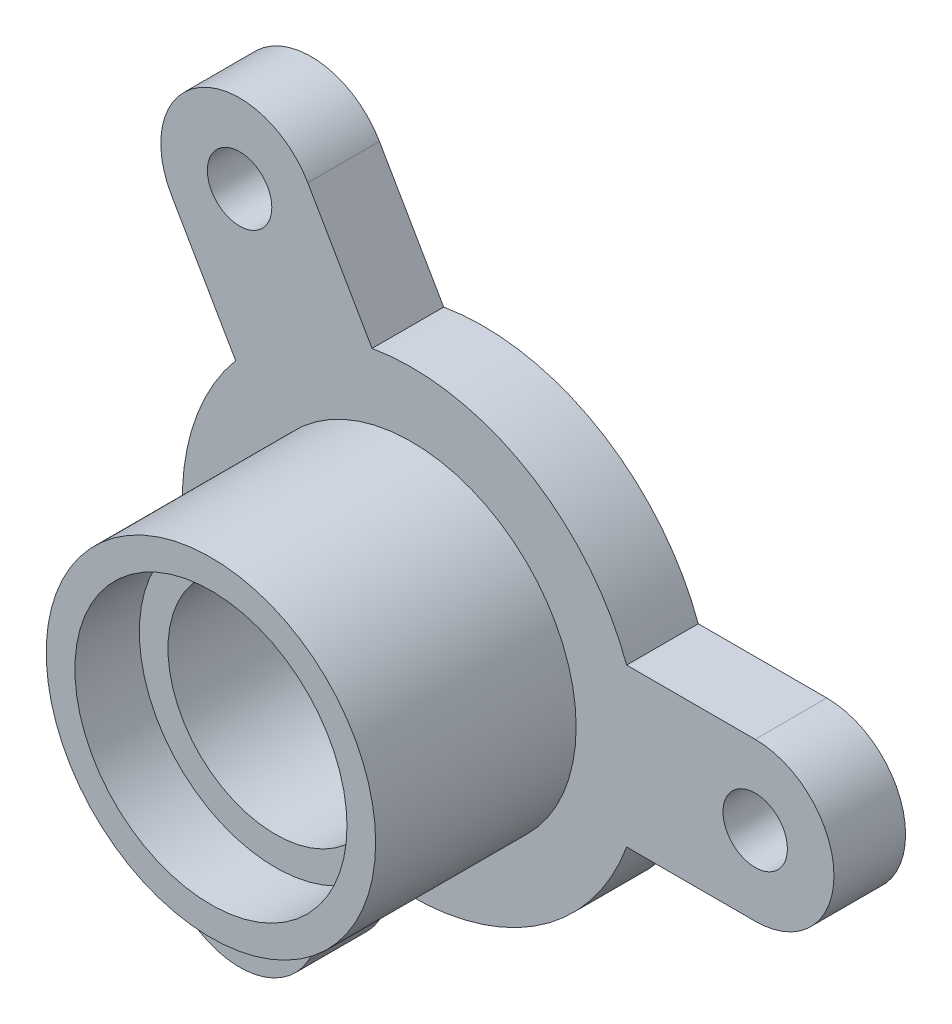
ISO-10303-21;
HEADER;
FILE_DESCRIPTION(('STEP AP214'),'2;1');
FILE_NAME('part.step','',(''),(''),'','','');
FILE_SCHEMA(('AUTOMOTIVE_DESIGN { 1 0 10303 214 1 1 1 1 }'));
ENDSEC;
DATA;
#1=APPLICATION_CONTEXT('core data for automotive mechanical design processes');
#2=APPLICATION_PROTOCOL_DEFINITION('international standard','automotive_design',2000,#1);
#3=PRODUCT_CONTEXT('',#1,'mechanical');
#4=PRODUCT('Part','Part','',(#3));
#5=PRODUCT_RELATED_PRODUCT_CATEGORY('part','',(#4));
#6=PRODUCT_DEFINITION_FORMATION('','',#4);
#7=PRODUCT_DEFINITION_CONTEXT('part definition',#1,'design');
#8=PRODUCT_DEFINITION('design','',#6,#7);
#9=PRODUCT_DEFINITION_SHAPE('','',#8);
#10=(LENGTH_UNIT() NAMED_UNIT(*) SI_UNIT(.MILLI.,.METRE.));
#11=(NAMED_UNIT(*) PLANE_ANGLE_UNIT() SI_UNIT($,.RADIAN.));
#12=(NAMED_UNIT(*) SI_UNIT($,.STERADIAN.) SOLID_ANGLE_UNIT());
#13=UNCERTAINTY_MEASURE_WITH_UNIT(LENGTH_MEASURE(1.E-05),#10,'distance_accuracy_value','');
#14=(GEOMETRIC_REPRESENTATION_CONTEXT(3) GLOBAL_UNCERTAINTY_ASSIGNED_CONTEXT((#13)) GLOBAL_UNIT_ASSIGNED_CONTEXT((#10,
#11,#12)) REPRESENTATION_CONTEXT('',''));
#15=CARTESIAN_POINT('',(0.,0.,0.));
#16=DIRECTION('',(0.,0.,1.));
#17=DIRECTION('',(1.,0.,0.));
#18=AXIS2_PLACEMENT_3D('',#15,#16,#17);
#19=CARTESIAN_POINT('',(0.,0.,0.));
#20=DIRECTION('',(0.,0.,1.));
#21=DIRECTION('',(1.,0.,0.));
#22=AXIS2_PLACEMENT_3D('',#19,#20,#21);
#23=CYLINDRICAL_SURFACE('',#22,15.);
#24=CARTESIAN_POINT('',(0.,0.,0.));
#25=DIRECTION('',(0.,0.,1.));
#26=DIRECTION('',(1.,0.,0.));
#27=AXIS2_PLACEMENT_3D('',#24,#25,#26);
#28=CIRCLE('',#27,15.);
#29=CARTESIAN_POINT('',(15.,0.,0.));
#30=VERTEX_POINT('',#29);
#31=EDGE_CURVE('E387',#30,#30,#28,.T.);
#32=ORIENTED_EDGE('',*,*,#31,.F.);
#33=EDGE_LOOP('',(#32));
#34=FACE_BOUND('',#33,.T.);
#35=CARTESIAN_POINT('',(0.,0.,29.));
#36=DIRECTION('',(0.,0.,1.));
#37=DIRECTION('',(1.,0.,0.));
#38=AXIS2_PLACEMENT_3D('',#35,#36,#37);
#39=CIRCLE('',#38,15.);
#40=CARTESIAN_POINT('',(15.,0.,29.));
#41=VERTEX_POINT('',#40);
#42=EDGE_CURVE('E56',#41,#41,#39,.F.);
#43=ORIENTED_EDGE('',*,*,#42,.F.);
#44=EDGE_LOOP('',(#43));
#45=FACE_BOUND('',#44,.T.);
#46=ADVANCED_FACE('F51',(#34,#45),#23,.F.);
#47=CARTESIAN_POINT('',(0.,0.,10.));
#48=DIRECTION('',(0.,0.,-1.));
#49=DIRECTION('',(-1.,0.,0.));
#50=AXIS2_PLACEMENT_3D('',#47,#48,#49);
#51=CYLINDRICAL_SURFACE('',#50,32.);
#52=DIRECTION('',(0.,0.,-1.));
#53=VECTOR('',#52,1.);
#54=CARTESIAN_POINT('',(-24.5512586429455,-20.5240273593462,10.));
#55=LINE('',#54,#53);
#56=CARTESIAN_POINT('',(-24.5512586429455,-20.5240273593462,10.));
#57=VERTEX_POINT('',#56);
#58=CARTESIAN_POINT('',(-24.5512586429455,-20.5240273593462,0.));
#59=VERTEX_POINT('',#58);
#60=EDGE_CURVE('E78',#57,#59,#55,.T.);
#61=ORIENTED_EDGE('',*,*,#60,.F.);
#62=CARTESIAN_POINT('',(0.,0.,10.));
#63=DIRECTION('',(0.,0.,1.));
#64=DIRECTION('',(1.,0.,0.));
#65=AXIS2_PLACEMENT_3D('',#62,#63,#64);
#66=CIRCLE('',#65,32.);
#67=CARTESIAN_POINT('',(-24.5512586429456,20.5240273593462,10.));
#68=VERTEX_POINT('',#67);
#69=EDGE_CURVE('E153',#68,#57,#66,.T.);
#70=ORIENTED_EDGE('',*,*,#69,.F.);
#71=DIRECTION('',(0.,0.,-1.));
#72=VECTOR('',#71,1.);
#73=CARTESIAN_POINT('',(-24.5512586429456,20.5240273593462,10.));
#74=LINE('',#73,#72);
#75=CARTESIAN_POINT('',(-24.5512586429456,20.5240273593462,0.));
#76=VERTEX_POINT('',#75);
#77=EDGE_CURVE('E166',#76,#68,#74,.F.);
#78=ORIENTED_EDGE('',*,*,#77,.F.);
#79=CARTESIAN_POINT('',(0.,0.,0.));
#80=DIRECTION('',(0.,0.,1.));
#81=DIRECTION('',(1.,0.,0.));
#82=AXIS2_PLACEMENT_3D('',#79,#80,#81);
#83=CIRCLE('',#82,32.);
#84=EDGE_CURVE('E269',#76,#59,#83,.T.);
#85=ORIENTED_EDGE('',*,*,#84,.T.);
#86=EDGE_LOOP('',(#61,#70,#78,#85));
#87=FACE_BOUND('',#86,.T.);
#88=ADVANCED_FACE('F54',(#87),#51,.T.);
#89=DIRECTION('',(0.,0.,-1.));
#90=VECTOR('',#89,1.);
#91=CARTESIAN_POINT('',(-5.49869975968788,-31.5240273593462,10.));
#92=LINE('',#91,#90);
#93=CARTESIAN_POINT('',(-5.49869975968788,-31.5240273593462,0.));
#94=VERTEX_POINT('',#93);
#95=CARTESIAN_POINT('',(-5.49869975968788,-31.5240273593462,10.));
#96=VERTEX_POINT('',#95);
#97=EDGE_CURVE('E225',#94,#96,#92,.F.);
#98=ORIENTED_EDGE('',*,*,#97,.F.);
#99=CARTESIAN_POINT('',(30.0499584026334,-11.,0.));
#100=VERTEX_POINT('',#99);
#101=EDGE_CURVE('E265',#94,#100,#83,.T.);
#102=ORIENTED_EDGE('',*,*,#101,.T.);
#103=DIRECTION('',(0.,0.,-1.));
#104=VECTOR('',#103,1.);
#105=CARTESIAN_POINT('',(30.0499584026334,-11.,10.));
#106=LINE('',#105,#104);
#107=CARTESIAN_POINT('',(30.0499584026334,-11.,10.));
#108=VERTEX_POINT('',#107);
#109=EDGE_CURVE('E261',#108,#100,#106,.T.);
#110=ORIENTED_EDGE('',*,*,#109,.F.);
#111=EDGE_CURVE('E70',#96,#108,#66,.T.);
#112=ORIENTED_EDGE('',*,*,#111,.F.);
#113=EDGE_LOOP('',(#98,#102,#110,#112));
#114=FACE_BOUND('',#113,.T.);
#115=ADVANCED_FACE('F276',(#114),#51,.T.);
#116=DIRECTION('',(0.,0.,-1.));
#117=VECTOR('',#116,1.);
#118=CARTESIAN_POINT('',(-5.49869975968791,31.5240273593462,10.));
#119=LINE('',#118,#117);
#120=CARTESIAN_POINT('',(-5.49869975968791,31.5240273593462,10.));
#121=VERTEX_POINT('',#120);
#122=CARTESIAN_POINT('',(-5.49869975968791,31.5240273593462,0.));
#123=VERTEX_POINT('',#122);
#124=EDGE_CURVE('E221',#121,#123,#119,.T.);
#125=ORIENTED_EDGE('',*,*,#124,.F.);
#126=CARTESIAN_POINT('',(30.0499584026334,11.,10.));
#127=VERTEX_POINT('',#126);
#128=EDGE_CURVE('E62',#127,#121,#66,.T.);
#129=ORIENTED_EDGE('',*,*,#128,.F.);
#130=DIRECTION('',(0.,0.,-1.));
#131=VECTOR('',#130,1.);
#132=CARTESIAN_POINT('',(30.0499584026334,11.,10.));
#133=LINE('',#132,#131);
#134=CARTESIAN_POINT('',(30.0499584026334,11.,0.));
#135=VERTEX_POINT('',#134);
#136=EDGE_CURVE('E257',#135,#127,#133,.F.);
#137=ORIENTED_EDGE('',*,*,#136,.F.);
#138=EDGE_CURVE('E267',#135,#123,#83,.T.);
#139=ORIENTED_EDGE('',*,*,#138,.T.);
#140=EDGE_LOOP('',(#125,#129,#137,#139));
#141=FACE_BOUND('',#140,.T.);
#142=ADVANCED_FACE('F311',(#141),#51,.T.);
#143=CARTESIAN_POINT('',(0.,0.,10.));
#144=DIRECTION('',(0.,0.,1.));
#145=DIRECTION('',(1.,0.,0.));
#146=AXIS2_PLACEMENT_3D('',#143,#144,#145);
#147=PLANE('',#146);
#148=CARTESIAN_POINT('',(48.,0.,10.));
#149=DIRECTION('',(0.,0.,1.));
#150=DIRECTION('',(1.,0.,0.));
#151=AXIS2_PLACEMENT_3D('',#148,#149,#150);
#152=CIRCLE('',#151,4.5);
#153=CARTESIAN_POINT('',(52.5,0.,10.));
#154=VERTEX_POINT('',#153);
#155=EDGE_CURVE('E414',#154,#154,#152,.T.);
#156=ORIENTED_EDGE('',*,*,#155,.F.);
#157=EDGE_LOOP('',(#156));
#158=FACE_BOUND('',#157,.T.);
#159=CARTESIAN_POINT('',(-24.,41.569219,10.));
#160=DIRECTION('',(0.,0.,1.));
#161=DIRECTION('',(1.,0.,0.));
#162=AXIS2_PLACEMENT_3D('',#159,#160,#161);
#163=CIRCLE('',#162,4.5);
#164=CARTESIAN_POINT('',(-19.5,41.569219,10.));
#165=VERTEX_POINT('',#164);
#166=EDGE_CURVE('E410',#165,#165,#163,.T.);
#167=ORIENTED_EDGE('',*,*,#166,.F.);
#168=EDGE_LOOP('',(#167));
#169=FACE_BOUND('',#168,.T.);
#170=CARTESIAN_POINT('',(-24.,-41.569219,10.));
#171=DIRECTION('',(0.,0.,1.));
#172=DIRECTION('',(1.,0.,0.));
#173=AXIS2_PLACEMENT_3D('',#170,#171,#172);
#174=CIRCLE('',#173,4.5);
#175=CARTESIAN_POINT('',(-19.5,-41.569219,10.));
#176=VERTEX_POINT('',#175);
#177=EDGE_CURVE('E405',#176,#176,#174,.T.);
#178=ORIENTED_EDGE('',*,*,#177,.F.);
#179=EDGE_LOOP('',(#178));
#180=FACE_BOUND('',#179,.T.);
#181=CARTESIAN_POINT('',(0.,0.,10.));
#182=DIRECTION('',(0.,0.,1.));
#183=DIRECTION('',(1.,0.,0.));
#184=AXIS2_PLACEMENT_3D('',#181,#182,#183);
#185=CIRCLE('',#184,23.);
#186=CARTESIAN_POINT('',(23.,0.,10.));
#187=VERTEX_POINT('',#186);
#188=EDGE_CURVE('E11',#187,#187,#185,.T.);
#189=ORIENTED_EDGE('',*,*,#188,.F.);
#190=EDGE_LOOP('',(#189));
#191=FACE_BOUND('',#190,.T.);
#192=ORIENTED_EDGE('',*,*,#128,.T.);
#193=DIRECTION('',(-0.5,0.866025403784438,0.));
#194=VECTOR('',#193,1.);
#195=CARTESIAN_POINT('',(-0.473720558371186,22.8205080756888,10.));
#196=LINE('',#195,#194);
#197=CARTESIAN_POINT('',(-14.4737205583712,47.069219381653,10.));
#198=VERTEX_POINT('',#197);
#199=EDGE_CURVE('E191',#121,#198,#196,.T.);
#200=ORIENTED_EDGE('',*,*,#199,.T.);
#201=CARTESIAN_POINT('',(-24.,41.569219381653,10.));
#202=DIRECTION('',(0.,0.,1.));
#203=DIRECTION('',(-0.5,0.866025403784438,0.));
#204=AXIS2_PLACEMENT_3D('',#201,#202,#203);
#205=CIRCLE('',#204,11.);
#206=CARTESIAN_POINT('',(-33.5262794416289,36.069219381653,10.));
#207=VERTEX_POINT('',#206);
#208=EDGE_CURVE('E194',#198,#207,#205,.T.);
#209=ORIENTED_EDGE('',*,*,#208,.T.);
#210=DIRECTION('',(0.5,-0.866025403784438,0.));
#211=VECTOR('',#210,1.);
#212=CARTESIAN_POINT('',(-33.5262794416288,36.069219381653,10.));
#213=LINE('',#212,#211);
#214=EDGE_CURVE('E198',#207,#68,#213,.T.);
#215=ORIENTED_EDGE('',*,*,#214,.T.);
#216=ORIENTED_EDGE('',*,*,#69,.T.);
#217=DIRECTION('',(-0.5,-0.866025403784439,0.));
#218=VECTOR('',#217,1.);
#219=CARTESIAN_POINT('',(-19.5262794416288,-11.8205080756888,10.));
#220=LINE('',#219,#218);
#221=CARTESIAN_POINT('',(-33.5262794416288,-36.0692193816531,10.));
#222=VERTEX_POINT('',#221);
#223=EDGE_CURVE('E144',#57,#222,#220,.T.);
#224=ORIENTED_EDGE('',*,*,#223,.T.);
#225=CARTESIAN_POINT('',(-24.,-41.5692193816531,10.));
#226=DIRECTION('',(0.,0.,1.));
#227=DIRECTION('',(-0.5,-0.866025403784439,0.));
#228=AXIS2_PLACEMENT_3D('',#225,#226,#227);
#229=CIRCLE('',#228,11.);
#230=CARTESIAN_POINT('',(-14.4737205583712,-47.0692193816531,10.));
#231=VERTEX_POINT('',#230);
#232=EDGE_CURVE('E150',#222,#231,#229,.T.);
#233=ORIENTED_EDGE('',*,*,#232,.T.);
#234=DIRECTION('',(0.5,0.866025403784439,0.));
#235=VECTOR('',#234,1.);
#236=CARTESIAN_POINT('',(-14.4737205583712,-47.0692193816531,10.));
#237=LINE('',#236,#235);
#238=EDGE_CURVE('E173',#231,#96,#237,.T.);
#239=ORIENTED_EDGE('',*,*,#238,.T.);
#240=ORIENTED_EDGE('',*,*,#111,.T.);
#241=DIRECTION('',(1.,0.,0.));
#242=VECTOR('',#241,1.);
#243=CARTESIAN_POINT('',(20.,-11.,10.));
#244=LINE('',#243,#242);
#245=CARTESIAN_POINT('',(48.,-11.,10.));
#246=VERTEX_POINT('',#245);
#247=EDGE_CURVE('E231',#108,#246,#244,.T.);
#248=ORIENTED_EDGE('',*,*,#247,.T.);
#249=CARTESIAN_POINT('',(48.,0.,10.));
#250=DIRECTION('',(0.,0.,1.));
#251=DIRECTION('',(1.,0.,0.));
#252=AXIS2_PLACEMENT_3D('',#249,#250,#251);
#253=CIRCLE('',#252,11.);
#254=CARTESIAN_POINT('',(48.,11.,10.));
#255=VERTEX_POINT('',#254);
#256=EDGE_CURVE('E234',#246,#255,#253,.T.);
#257=ORIENTED_EDGE('',*,*,#256,.T.);
#258=DIRECTION('',(-1.,0.,0.));
#259=VECTOR('',#258,1.);
#260=CARTESIAN_POINT('',(48.,11.,10.));
#261=LINE('',#260,#259);
#262=EDGE_CURVE('E238',#255,#127,#261,.T.);
#263=ORIENTED_EDGE('',*,*,#262,.T.);
#264=EDGE_LOOP('',(#192,#200,#209,#215,#216,#224,#233,#239,#240,#248,#257,#263));
#265=FACE_BOUND('',#264,.T.);
#266=ADVANCED_FACE('F147',(#158,#169,#180,#191,#265),#147,.T.);
#267=CARTESIAN_POINT('',(0.,0.,0.));
#268=DIRECTION('',(0.,0.,1.));
#269=DIRECTION('',(1.,0.,0.));
#270=AXIS2_PLACEMENT_3D('',#267,#268,#269);
#271=PLANE('',#270);
#272=CARTESIAN_POINT('',(48.,0.,0.));
#273=DIRECTION('',(0.,0.,1.));
#274=DIRECTION('',(1.,0.,0.));
#275=AXIS2_PLACEMENT_3D('',#272,#273,#274);
#276=CIRCLE('',#275,4.5);
#277=CARTESIAN_POINT('',(52.5,0.,0.));
#278=VERTEX_POINT('',#277);
#279=EDGE_CURVE('E377',#278,#278,#276,.T.);
#280=ORIENTED_EDGE('',*,*,#279,.T.);
#281=EDGE_LOOP('',(#280));
#282=FACE_BOUND('',#281,.T.);
#283=CARTESIAN_POINT('',(-24.,41.569219,0.));
#284=DIRECTION('',(0.,0.,1.));
#285=DIRECTION('',(1.,0.,0.));
#286=AXIS2_PLACEMENT_3D('',#283,#284,#285);
#287=CIRCLE('',#286,4.5);
#288=CARTESIAN_POINT('',(-19.5,41.569219,0.));
#289=VERTEX_POINT('',#288);
#290=EDGE_CURVE('E381',#289,#289,#287,.T.);
#291=ORIENTED_EDGE('',*,*,#290,.T.);
#292=EDGE_LOOP('',(#291));
#293=FACE_BOUND('',#292,.T.);
#294=CARTESIAN_POINT('',(-24.,-41.569219,0.));
#295=DIRECTION('',(0.,0.,1.));
#296=DIRECTION('',(1.,0.,0.));
#297=AXIS2_PLACEMENT_3D('',#294,#295,#296);
#298=CIRCLE('',#297,4.5);
#299=CARTESIAN_POINT('',(-19.5,-41.569219,0.));
#300=VERTEX_POINT('',#299);
#301=EDGE_CURVE('E385',#300,#300,#298,.T.);
#302=ORIENTED_EDGE('',*,*,#301,.T.);
#303=EDGE_LOOP('',(#302));
#304=FACE_BOUND('',#303,.T.);
#305=ORIENTED_EDGE('',*,*,#31,.T.);
#306=EDGE_LOOP('',(#305));
#307=FACE_BOUND('',#306,.T.);
#308=ORIENTED_EDGE('',*,*,#84,.F.);
#309=DIRECTION('',(0.5,-0.866025403784438,0.));
#310=VECTOR('',#309,1.);
#311=CARTESIAN_POINT('',(-33.5262794416288,36.069219381653,0.));
#312=LINE('',#311,#310);
#313=CARTESIAN_POINT('',(-33.5262794416289,36.069219381653,0.));
#314=VERTEX_POINT('',#313);
#315=EDGE_CURVE('E195',#314,#76,#312,.T.);
#316=ORIENTED_EDGE('',*,*,#315,.F.);
#317=CARTESIAN_POINT('',(-24.,41.569219381653,0.));
#318=DIRECTION('',(0.,0.,1.));
#319=DIRECTION('',(-0.5,0.866025403784438,0.));
#320=AXIS2_PLACEMENT_3D('',#317,#318,#319);
#321=CIRCLE('',#320,11.);
#322=CARTESIAN_POINT('',(-14.4737205583712,47.069219381653,0.));
#323=VERTEX_POINT('',#322);
#324=EDGE_CURVE('E205',#323,#314,#321,.T.);
#325=ORIENTED_EDGE('',*,*,#324,.F.);
#326=DIRECTION('',(-0.5,0.866025403784438,0.));
#327=VECTOR('',#326,1.);
#328=CARTESIAN_POINT('',(-0.473720558371186,22.8205080756888,0.));
#329=LINE('',#328,#327);
#330=EDGE_CURVE('E202',#123,#323,#329,.T.);
#331=ORIENTED_EDGE('',*,*,#330,.F.);
#332=ORIENTED_EDGE('',*,*,#138,.F.);
#333=DIRECTION('',(-1.,0.,0.));
#334=VECTOR('',#333,1.);
#335=CARTESIAN_POINT('',(48.,11.,0.));
#336=LINE('',#335,#334);
#337=CARTESIAN_POINT('',(48.,11.,0.));
#338=VERTEX_POINT('',#337);
#339=EDGE_CURVE('E235',#338,#135,#336,.T.);
#340=ORIENTED_EDGE('',*,*,#339,.F.);
#341=CARTESIAN_POINT('',(48.,0.,0.));
#342=DIRECTION('',(0.,0.,1.));
#343=DIRECTION('',(1.,0.,0.));
#344=AXIS2_PLACEMENT_3D('',#341,#342,#343);
#345=CIRCLE('',#344,11.);
#346=CARTESIAN_POINT('',(48.,-11.,0.));
#347=VERTEX_POINT('',#346);
#348=EDGE_CURVE('E245',#347,#338,#345,.T.);
#349=ORIENTED_EDGE('',*,*,#348,.F.);
#350=DIRECTION('',(1.,0.,0.));
#351=VECTOR('',#350,1.);
#352=CARTESIAN_POINT('',(20.,-11.,0.));
#353=LINE('',#352,#351);
#354=EDGE_CURVE('E230',#100,#347,#353,.T.);
#355=ORIENTED_EDGE('',*,*,#354,.F.);
#356=ORIENTED_EDGE('',*,*,#101,.F.);
#357=DIRECTION('',(0.5,0.866025403784439,0.));
#358=VECTOR('',#357,1.);
#359=CARTESIAN_POINT('',(-14.4737205583712,-47.0692193816531,0.));
#360=LINE('',#359,#358);
#361=CARTESIAN_POINT('',(-14.4737205583712,-47.0692193816531,0.));
#362=VERTEX_POINT('',#361);
#363=EDGE_CURVE('E156',#362,#94,#360,.T.);
#364=ORIENTED_EDGE('',*,*,#363,.F.);
#365=CARTESIAN_POINT('',(-24.,-41.5692193816531,0.));
#366=DIRECTION('',(0.,0.,1.));
#367=DIRECTION('',(-0.5,-0.866025403784439,0.));
#368=AXIS2_PLACEMENT_3D('',#365,#366,#367);
#369=CIRCLE('',#368,11.);
#370=CARTESIAN_POINT('',(-33.5262794416288,-36.0692193816531,0.));
#371=VERTEX_POINT('',#370);
#372=EDGE_CURVE('E182',#371,#362,#369,.T.);
#373=ORIENTED_EDGE('',*,*,#372,.F.);
#374=DIRECTION('',(-0.5,-0.866025403784439,0.));
#375=VECTOR('',#374,1.);
#376=CARTESIAN_POINT('',(-19.5262794416288,-11.8205080756888,0.));
#377=LINE('',#376,#375);
#378=EDGE_CURVE('E162',#59,#371,#377,.T.);
#379=ORIENTED_EDGE('',*,*,#378,.F.);
#380=EDGE_LOOP('',(#308,#316,#325,#331,#332,#340,#349,#355,#356,#364,#373,#379));
#381=FACE_BOUND('',#380,.T.);
#382=ADVANCED_FACE('F285',(#282,#293,#304,#307,#381),#271,.F.);
#383=CARTESIAN_POINT('',(20.,-11.,10.));
#384=DIRECTION('',(0.,1.,0.));
#385=DIRECTION('',(0.,0.,1.));
#386=AXIS2_PLACEMENT_3D('',#383,#384,#385);
#387=PLANE('',#386);
#388=ORIENTED_EDGE('',*,*,#247,.F.);
#389=ORIENTED_EDGE('',*,*,#109,.T.);
#390=ORIENTED_EDGE('',*,*,#354,.T.);
#391=DIRECTION('',(0.,0.,-1.));
#392=VECTOR('',#391,1.);
#393=CARTESIAN_POINT('',(48.,-11.,10.));
#394=LINE('',#393,#392);
#395=EDGE_CURVE('E253',#246,#347,#394,.T.);
#396=ORIENTED_EDGE('',*,*,#395,.F.);
#397=EDGE_LOOP('',(#388,#389,#390,#396));
#398=FACE_BOUND('',#397,.T.);
#399=ADVANCED_FACE('F282',(#398),#387,.F.);
#400=CARTESIAN_POINT('',(48.,11.,10.));
#401=DIRECTION('',(0.,-1.,0.));
#402=DIRECTION('',(0.,0.,-1.));
#403=AXIS2_PLACEMENT_3D('',#400,#401,#402);
#404=PLANE('',#403);
#405=ORIENTED_EDGE('',*,*,#339,.T.);
#406=ORIENTED_EDGE('',*,*,#136,.T.);
#407=ORIENTED_EDGE('',*,*,#262,.F.);
#408=DIRECTION('',(0.,0.,-1.));
#409=VECTOR('',#408,1.);
#410=CARTESIAN_POINT('',(48.,11.,10.));
#411=LINE('',#410,#409);
#412=EDGE_CURVE('E242',#255,#338,#411,.T.);
#413=ORIENTED_EDGE('',*,*,#412,.T.);
#414=EDGE_LOOP('',(#405,#406,#407,#413));
#415=FACE_BOUND('',#414,.T.);
#416=ADVANCED_FACE('F293',(#415),#404,.F.);
#417=CARTESIAN_POINT('',(48.,0.,10.));
#418=DIRECTION('',(0.,0.,-1.));
#419=DIRECTION('',(-1.,0.,0.));
#420=AXIS2_PLACEMENT_3D('',#417,#418,#419);
#421=CYLINDRICAL_SURFACE('',#420,11.);
#422=ORIENTED_EDGE('',*,*,#348,.T.);
#423=ORIENTED_EDGE('',*,*,#412,.F.);
#424=ORIENTED_EDGE('',*,*,#256,.F.);
#425=ORIENTED_EDGE('',*,*,#395,.T.);
#426=EDGE_LOOP('',(#422,#423,#424,#425));
#427=FACE_BOUND('',#426,.T.);
#428=ADVANCED_FACE('F289',(#427),#421,.T.);
#429=CARTESIAN_POINT('',(-0.473720558371186,22.8205080756888,10.));
#430=DIRECTION('',(-0.866025403784438,-0.5,0.));
#431=DIRECTION('',(0.5,-0.866025403784438,0.));
#432=AXIS2_PLACEMENT_3D('',#429,#430,#431);
#433=PLANE('',#432);
#434=ORIENTED_EDGE('',*,*,#199,.F.);
#435=ORIENTED_EDGE('',*,*,#124,.T.);
#436=ORIENTED_EDGE('',*,*,#330,.T.);
#437=DIRECTION('',(0.,0.,-1.));
#438=VECTOR('',#437,1.);
#439=CARTESIAN_POINT('',(-14.4737205583712,47.069219381653,10.));
#440=LINE('',#439,#438);
#441=EDGE_CURVE('E183',#198,#323,#440,.T.);
#442=ORIENTED_EDGE('',*,*,#441,.F.);
#443=EDGE_LOOP('',(#434,#435,#436,#442));
#444=FACE_BOUND('',#443,.T.);
#445=ADVANCED_FACE('F310',(#444),#433,.F.);
#446=CARTESIAN_POINT('',(-33.5262794416288,36.069219381653,10.));
#447=DIRECTION('',(0.866025403784438,0.5,0.));
#448=DIRECTION('',(-0.5,0.866025403784438,0.));
#449=AXIS2_PLACEMENT_3D('',#446,#447,#448);
#450=PLANE('',#449);
#451=ORIENTED_EDGE('',*,*,#315,.T.);
#452=ORIENTED_EDGE('',*,*,#77,.T.);
#453=ORIENTED_EDGE('',*,*,#214,.F.);
#454=DIRECTION('',(0.,0.,-1.));
#455=VECTOR('',#454,1.);
#456=CARTESIAN_POINT('',(-33.5262794416289,36.069219381653,10.));
#457=LINE('',#456,#455);
#458=EDGE_CURVE('E201',#207,#314,#457,.T.);
#459=ORIENTED_EDGE('',*,*,#458,.T.);
#460=EDGE_LOOP('',(#451,#452,#453,#459));
#461=FACE_BOUND('',#460,.T.);
#462=ADVANCED_FACE('F302',(#461),#450,.F.);
#463=CARTESIAN_POINT('',(-24.,41.569219381653,10.));
#464=DIRECTION('',(0.,0.,-1.));
#465=DIRECTION('',(-1.,0.,0.));
#466=AXIS2_PLACEMENT_3D('',#463,#464,#465);
#467=CYLINDRICAL_SURFACE('',#466,11.);
#468=ORIENTED_EDGE('',*,*,#324,.T.);
#469=ORIENTED_EDGE('',*,*,#458,.F.);
#470=ORIENTED_EDGE('',*,*,#208,.F.);
#471=ORIENTED_EDGE('',*,*,#441,.T.);
#472=EDGE_LOOP('',(#468,#469,#470,#471));
#473=FACE_BOUND('',#472,.T.);
#474=ADVANCED_FACE('F306',(#473),#467,.T.);
#475=CARTESIAN_POINT('',(-19.5262794416288,-11.8205080756888,10.));
#476=DIRECTION('',(0.866025403784439,-0.5,0.));
#477=DIRECTION('',(0.5,0.866025403784439,0.));
#478=AXIS2_PLACEMENT_3D('',#475,#476,#477);
#479=PLANE('',#478);
#480=ORIENTED_EDGE('',*,*,#223,.F.);
#481=ORIENTED_EDGE('',*,*,#60,.T.);
#482=ORIENTED_EDGE('',*,*,#378,.T.);
#483=DIRECTION('',(0.,0.,-1.));
#484=VECTOR('',#483,1.);
#485=CARTESIAN_POINT('',(-33.5262794416288,-36.0692193816531,10.));
#486=LINE('',#485,#484);
#487=EDGE_CURVE('E159',#222,#371,#486,.T.);
#488=ORIENTED_EDGE('',*,*,#487,.F.);
#489=EDGE_LOOP('',(#480,#481,#482,#488));
#490=FACE_BOUND('',#489,.T.);
#491=ADVANCED_FACE('F160',(#490),#479,.F.);
#492=CARTESIAN_POINT('',(-14.4737205583712,-47.0692193816531,10.));
#493=DIRECTION('',(-0.866025403784439,0.5,0.));
#494=DIRECTION('',(-0.5,-0.866025403784439,0.));
#495=AXIS2_PLACEMENT_3D('',#492,#493,#494);
#496=PLANE('',#495);
#497=ORIENTED_EDGE('',*,*,#363,.T.);
#498=ORIENTED_EDGE('',*,*,#97,.T.);
#499=ORIENTED_EDGE('',*,*,#238,.F.);
#500=DIRECTION('',(0.,0.,-1.));
#501=VECTOR('',#500,1.);
#502=CARTESIAN_POINT('',(-14.4737205583712,-47.0692193816531,10.));
#503=LINE('',#502,#501);
#504=EDGE_CURVE('E167',#231,#362,#503,.T.);
#505=ORIENTED_EDGE('',*,*,#504,.T.);
#506=EDGE_LOOP('',(#497,#498,#499,#505));
#507=FACE_BOUND('',#506,.T.);
#508=ADVANCED_FACE('F296',(#507),#496,.F.);
#509=CARTESIAN_POINT('',(-24.,-41.5692193816531,10.));
#510=DIRECTION('',(0.,0.,-1.));
#511=DIRECTION('',(-1.,0.,0.));
#512=AXIS2_PLACEMENT_3D('',#509,#510,#511);
#513=CYLINDRICAL_SURFACE('',#512,11.);
#514=ORIENTED_EDGE('',*,*,#372,.T.);
#515=ORIENTED_EDGE('',*,*,#504,.F.);
#516=ORIENTED_EDGE('',*,*,#232,.F.);
#517=ORIENTED_EDGE('',*,*,#487,.T.);
#518=EDGE_LOOP('',(#514,#515,#516,#517));
#519=FACE_BOUND('',#518,.T.);
#520=ADVANCED_FACE('F169',(#519),#513,.T.);
#521=CARTESIAN_POINT('',(0.,0.,38.));
#522=DIRECTION('',(0.,0.,-1.));
#523=DIRECTION('',(-1.,0.,0.));
#524=AXIS2_PLACEMENT_3D('',#521,#522,#523);
#525=CYLINDRICAL_SURFACE('',#524,23.);
#526=CARTESIAN_POINT('',(0.,0.,38.));
#527=DIRECTION('',(0.,0.,1.));
#528=DIRECTION('',(1.,0.,0.));
#529=AXIS2_PLACEMENT_3D('',#526,#527,#528);
#530=CIRCLE('',#529,23.);
#531=CARTESIAN_POINT('',(23.,0.,38.));
#532=VERTEX_POINT('',#531);
#533=EDGE_CURVE('E206',#532,#532,#530,.T.);
#534=ORIENTED_EDGE('',*,*,#533,.F.);
#535=EDGE_LOOP('',(#534));
#536=FACE_BOUND('',#535,.T.);
#537=ORIENTED_EDGE('',*,*,#188,.T.);
#538=EDGE_LOOP('',(#537));
#539=FACE_BOUND('',#538,.T.);
#540=ADVANCED_FACE('F338',(#536,#539),#525,.T.);
#541=CARTESIAN_POINT('',(0.,0.,38.));
#542=DIRECTION('',(0.,0.,1.));
#543=DIRECTION('',(1.,0.,0.));
#544=AXIS2_PLACEMENT_3D('',#541,#542,#543);
#545=PLANE('',#544);
#546=CARTESIAN_POINT('',(0.,0.,38.));
#547=DIRECTION('',(0.,0.,1.));
#548=DIRECTION('',(1.,0.,0.));
#549=AXIS2_PLACEMENT_3D('',#546,#547,#548);
#550=CIRCLE('',#549,19.);
#551=CARTESIAN_POINT('',(19.,0.,38.));
#552=VERTEX_POINT('',#551);
#553=EDGE_CURVE('E397',#552,#552,#550,.T.);
#554=ORIENTED_EDGE('',*,*,#553,.F.);
#555=EDGE_LOOP('',(#554));
#556=FACE_BOUND('',#555,.T.);
#557=ORIENTED_EDGE('',*,*,#533,.T.);
#558=EDGE_LOOP('',(#557));
#559=FACE_BOUND('',#558,.T.);
#560=ADVANCED_FACE('F332',(#556,#559),#545,.T.);
#561=CARTESIAN_POINT('',(0.,0.,29.));
#562=DIRECTION('',(0.,0.,1.));
#563=DIRECTION('',(1.,0.,0.));
#564=AXIS2_PLACEMENT_3D('',#561,#562,#563);
#565=PLANE('',#564);
#566=CARTESIAN_POINT('',(0.,0.,29.));
#567=DIRECTION('',(0.,0.,1.));
#568=DIRECTION('',(1.,0.,0.));
#569=AXIS2_PLACEMENT_3D('',#566,#567,#568);
#570=CIRCLE('',#569,19.);
#571=CARTESIAN_POINT('',(19.,0.,29.));
#572=VERTEX_POINT('',#571);
#573=EDGE_CURVE('E395',#572,#572,#570,.T.);
#574=ORIENTED_EDGE('',*,*,#573,.T.);
#575=EDGE_LOOP('',(#574));
#576=FACE_BOUND('',#575,.T.);
#577=ORIENTED_EDGE('',*,*,#42,.T.);
#578=EDGE_LOOP('',(#577));
#579=FACE_BOUND('',#578,.T.);
#580=ADVANCED_FACE('F337',(#576,#579),#565,.T.);
#581=CARTESIAN_POINT('',(0.,0.,29.));
#582=DIRECTION('',(0.,0.,1.));
#583=DIRECTION('',(1.,0.,0.));
#584=AXIS2_PLACEMENT_3D('',#581,#582,#583);
#585=CYLINDRICAL_SURFACE('',#584,19.);
#586=ORIENTED_EDGE('',*,*,#573,.F.);
#587=EDGE_LOOP('',(#586));
#588=FACE_BOUND('',#587,.T.);
#589=ORIENTED_EDGE('',*,*,#553,.T.);
#590=EDGE_LOOP('',(#589));
#591=FACE_BOUND('',#590,.T.);
#592=ADVANCED_FACE('F329',(#588,#591),#585,.F.);
#593=CARTESIAN_POINT('',(-24.,-41.569219,0.));
#594=DIRECTION('',(0.,0.,1.));
#595=DIRECTION('',(1.,0.,0.));
#596=AXIS2_PLACEMENT_3D('',#593,#594,#595);
#597=CYLINDRICAL_SURFACE('',#596,4.5);
#598=ORIENTED_EDGE('',*,*,#301,.F.);
#599=EDGE_LOOP('',(#598));
#600=FACE_BOUND('',#599,.T.);
#601=ORIENTED_EDGE('',*,*,#177,.T.);
#602=EDGE_LOOP('',(#601));
#603=FACE_BOUND('',#602,.T.);
#604=ADVANCED_FACE('F431',(#600,#603),#597,.F.);
#605=CARTESIAN_POINT('',(-24.,41.569219,0.));
#606=DIRECTION('',(0.,0.,1.));
#607=DIRECTION('',(1.,0.,0.));
#608=AXIS2_PLACEMENT_3D('',#605,#606,#607);
#609=CYLINDRICAL_SURFACE('',#608,4.5);
#610=ORIENTED_EDGE('',*,*,#290,.F.);
#611=EDGE_LOOP('',(#610));
#612=FACE_BOUND('',#611,.T.);
#613=ORIENTED_EDGE('',*,*,#166,.T.);
#614=EDGE_LOOP('',(#613));
#615=FACE_BOUND('',#614,.T.);
#616=ADVANCED_FACE('F433',(#612,#615),#609,.F.);
#617=CARTESIAN_POINT('',(48.,0.,0.));
#618=DIRECTION('',(0.,0.,1.));
#619=DIRECTION('',(1.,0.,0.));
#620=AXIS2_PLACEMENT_3D('',#617,#618,#619);
#621=CYLINDRICAL_SURFACE('',#620,4.5);
#622=ORIENTED_EDGE('',*,*,#279,.F.);
#623=EDGE_LOOP('',(#622));
#624=FACE_BOUND('',#623,.T.);
#625=ORIENTED_EDGE('',*,*,#155,.T.);
#626=EDGE_LOOP('',(#625));
#627=FACE_BOUND('',#626,.T.);
#628=ADVANCED_FACE('F422',(#624,#627),#621,.F.);
#629=CLOSED_SHELL('',(#46,#88,#115,#142,#266,#382,#399,#416,#428,#445,#462,#474,#491,#508,#520,
#540,#560,#580,#592,#604,#616,#628));
#630=MANIFOLD_SOLID_BREP('B2',#629);
#631=ADVANCED_BREP_SHAPE_REPRESENTATION('',(#18,#630),#14);
#632=SHAPE_DEFINITION_REPRESENTATION(#9,#631);
ENDSEC;
END-ISO-10303-21;
